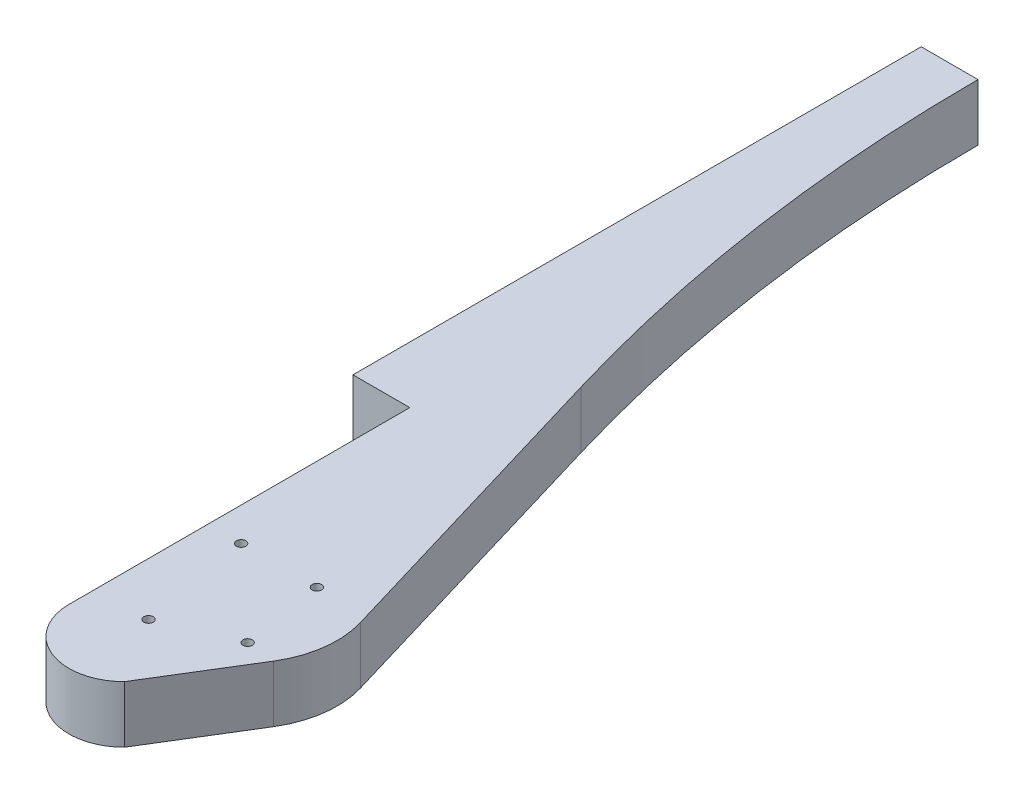
ISO-10303-21;
HEADER;
FILE_DESCRIPTION(('STEP AP214'),'2;1');
FILE_NAME('part.step','',(''),(''),'','','');
FILE_SCHEMA(('AUTOMOTIVE_DESIGN { 1 0 10303 214 1 1 1 1 }'));
ENDSEC;
DATA;
#1=APPLICATION_CONTEXT('core data for automotive mechanical design processes');
#2=APPLICATION_PROTOCOL_DEFINITION('international standard','automotive_design',2000,#1);
#3=PRODUCT_CONTEXT('',#1,'mechanical');
#4=PRODUCT('Part','Part','',(#3));
#5=PRODUCT_RELATED_PRODUCT_CATEGORY('part','',(#4));
#6=PRODUCT_DEFINITION_FORMATION('','',#4);
#7=PRODUCT_DEFINITION_CONTEXT('part definition',#1,'design');
#8=PRODUCT_DEFINITION('design','',#6,#7);
#9=PRODUCT_DEFINITION_SHAPE('','',#8);
#10=(LENGTH_UNIT() NAMED_UNIT(*) SI_UNIT(.MILLI.,.METRE.));
#11=(NAMED_UNIT(*) PLANE_ANGLE_UNIT() SI_UNIT($,.RADIAN.));
#12=(NAMED_UNIT(*) SI_UNIT($,.STERADIAN.) SOLID_ANGLE_UNIT());
#13=UNCERTAINTY_MEASURE_WITH_UNIT(LENGTH_MEASURE(1.E-05),#10,'distance_accuracy_value','');
#14=(GEOMETRIC_REPRESENTATION_CONTEXT(3) GLOBAL_UNCERTAINTY_ASSIGNED_CONTEXT((#13)) GLOBAL_UNIT_ASSIGNED_CONTEXT((#10,
#11,#12)) REPRESENTATION_CONTEXT('',''));
#15=CARTESIAN_POINT('',(0.,0.,0.));
#16=DIRECTION('',(0.,0.,1.));
#17=DIRECTION('',(1.,0.,0.));
#18=AXIS2_PLACEMENT_3D('',#15,#16,#17);
#19=CARTESIAN_POINT('',(545.559709198335,19.05,-304.8));
#20=DIRECTION('',(0.,-1.,0.));
#21=DIRECTION('',(0.,0.,-1.));
#22=AXIS2_PLACEMENT_3D('',#19,#20,#21);
#23=CYLINDRICAL_SURFACE('',#22,545.559709198344);
#24=CARTESIAN_POINT('',(545.559709198335,0.,-304.8));
#25=DIRECTION('',(0.,-1.,0.));
#26=DIRECTION('',(0.,0.,-1.));
#27=AXIS2_PLACEMENT_3D('',#24,#25,#26);
#28=CIRCLE('',#27,545.559709198344);
#29=CARTESIAN_POINT('',(22.7226034286536,0.,-148.989996691602));
#30=VERTEX_POINT('',#29);
#31=CARTESIAN_POINT('',(-1.07275299754406E-11,0.,-304.8));
#32=VERTEX_POINT('',#31);
#33=EDGE_CURVE('E138',#30,#32,#28,.T.);
#34=ORIENTED_EDGE('',*,*,#33,.T.);
#35=DIRECTION('',(0.,-1.,0.));
#36=VECTOR('',#35,1.);
#37=CARTESIAN_POINT('',(-1.07275299754406E-11,19.05,-304.8));
#38=LINE('',#37,#36);
#39=CARTESIAN_POINT('',(-1.07275299754406E-11,19.05,-304.8));
#40=VERTEX_POINT('',#39);
#41=EDGE_CURVE('E11',#40,#32,#38,.T.);
#42=ORIENTED_EDGE('',*,*,#41,.F.);
#43=CARTESIAN_POINT('',(545.559709198335,19.05,-304.8));
#44=DIRECTION('',(0.,-1.,0.));
#45=DIRECTION('',(0.,0.,-1.));
#46=AXIS2_PLACEMENT_3D('',#43,#44,#45);
#47=CIRCLE('',#46,545.559709198344);
#48=CARTESIAN_POINT('',(22.7226034286536,19.05,-148.989996691602));
#49=VERTEX_POINT('',#48);
#50=EDGE_CURVE('E155',#49,#40,#47,.T.);
#51=ORIENTED_EDGE('',*,*,#50,.F.);
#52=DIRECTION('',(0.,-1.,0.));
#53=VECTOR('',#52,1.);
#54=CARTESIAN_POINT('',(22.7226034286536,19.05,-148.989996691602));
#55=LINE('',#54,#53);
#56=EDGE_CURVE('E134',#49,#30,#55,.T.);
#57=ORIENTED_EDGE('',*,*,#56,.T.);
#58=EDGE_LOOP('',(#34,#42,#51,#57));
#59=FACE_BOUND('',#58,.T.);
#60=ADVANCED_FACE('F33',(#59),#23,.F.);
#61=CARTESIAN_POINT('',(-1.07275299754406E-11,19.05,-304.8));
#62=DIRECTION('',(0.,0.,1.));
#63=DIRECTION('',(1.,0.,0.));
#64=AXIS2_PLACEMENT_3D('',#61,#62,#63);
#65=PLANE('',#64);
#66=DIRECTION('',(-1.,0.,0.));
#67=VECTOR('',#66,1.);
#68=CARTESIAN_POINT('',(-1.07275299754406E-11,0.,-304.8));
#69=LINE('',#68,#67);
#70=CARTESIAN_POINT('',(-19.05,0.,-304.8));
#71=VERTEX_POINT('',#70);
#72=EDGE_CURVE('E141',#32,#71,#69,.T.);
#73=ORIENTED_EDGE('',*,*,#72,.T.);
#74=DIRECTION('',(0.,-1.,0.));
#75=VECTOR('',#74,1.);
#76=CARTESIAN_POINT('',(-19.05,19.05,-304.8));
#77=LINE('',#76,#75);
#78=CARTESIAN_POINT('',(-19.05,19.05,-304.8));
#79=VERTEX_POINT('',#78);
#80=EDGE_CURVE('E41',#79,#71,#77,.T.);
#81=ORIENTED_EDGE('',*,*,#80,.F.);
#82=DIRECTION('',(-1.,0.,0.));
#83=VECTOR('',#82,1.);
#84=CARTESIAN_POINT('',(-1.07275299754406E-11,19.05,-304.8));
#85=LINE('',#84,#83);
#86=EDGE_CURVE('E96',#40,#79,#85,.T.);
#87=ORIENTED_EDGE('',*,*,#86,.F.);
#88=ORIENTED_EDGE('',*,*,#41,.T.);
#89=EDGE_LOOP('',(#73,#81,#87,#88));
#90=FACE_BOUND('',#89,.T.);
#91=ADVANCED_FACE('F268',(#90),#65,.F.);
#92=CARTESIAN_POINT('',(-19.05,19.05,-304.8));
#93=DIRECTION('',(1.,0.,0.));
#94=DIRECTION('',(0.,0.,-1.));
#95=AXIS2_PLACEMENT_3D('',#92,#93,#94);
#96=PLANE('',#95);
#97=DIRECTION('',(0.,0.,1.));
#98=VECTOR('',#97,1.);
#99=CARTESIAN_POINT('',(-19.05,0.,-304.8));
#100=LINE('',#99,#98);
#101=CARTESIAN_POINT('',(-19.05,0.,-114.3));
#102=VERTEX_POINT('',#101);
#103=EDGE_CURVE('E144',#71,#102,#100,.T.);
#104=ORIENTED_EDGE('',*,*,#103,.T.);
#105=DIRECTION('',(0.,-1.,0.));
#106=VECTOR('',#105,1.);
#107=CARTESIAN_POINT('',(-19.05,19.05,-114.3));
#108=LINE('',#107,#106);
#109=CARTESIAN_POINT('',(-19.05,19.05,-114.3));
#110=VERTEX_POINT('',#109);
#111=EDGE_CURVE('E165',#110,#102,#108,.T.);
#112=ORIENTED_EDGE('',*,*,#111,.F.);
#113=DIRECTION('',(0.,0.,1.));
#114=VECTOR('',#113,1.);
#115=CARTESIAN_POINT('',(-19.05,19.05,-304.8));
#116=LINE('',#115,#114);
#117=EDGE_CURVE('E173',#79,#110,#116,.T.);
#118=ORIENTED_EDGE('',*,*,#117,.F.);
#119=ORIENTED_EDGE('',*,*,#80,.T.);
#120=EDGE_LOOP('',(#104,#112,#118,#119));
#121=FACE_BOUND('',#120,.T.);
#122=ADVANCED_FACE('F171',(#121),#96,.F.);
#123=CARTESIAN_POINT('',(-19.05,19.05,-114.3));
#124=DIRECTION('',(0.,0.,-1.));
#125=DIRECTION('',(-1.,0.,0.));
#126=AXIS2_PLACEMENT_3D('',#123,#124,#125);
#127=PLANE('',#126);
#128=DIRECTION('',(1.,0.,0.));
#129=VECTOR('',#128,1.);
#130=CARTESIAN_POINT('',(-19.05,0.,-114.3));
#131=LINE('',#130,#129);
#132=CARTESIAN_POINT('',(0.,0.,-114.3));
#133=VERTEX_POINT('',#132);
#134=EDGE_CURVE('E146',#102,#133,#131,.T.);
#135=ORIENTED_EDGE('',*,*,#134,.T.);
#136=DIRECTION('',(0.,-1.,0.));
#137=VECTOR('',#136,1.);
#138=CARTESIAN_POINT('',(0.,19.05,-114.3));
#139=LINE('',#138,#137);
#140=CARTESIAN_POINT('',(0.,19.05,-114.3));
#141=VERTEX_POINT('',#140);
#142=EDGE_CURVE('E162',#141,#133,#139,.T.);
#143=ORIENTED_EDGE('',*,*,#142,.F.);
#144=DIRECTION('',(1.,0.,0.));
#145=VECTOR('',#144,1.);
#146=CARTESIAN_POINT('',(-19.05,19.05,-114.3));
#147=LINE('',#146,#145);
#148=EDGE_CURVE('E189',#110,#141,#147,.T.);
#149=ORIENTED_EDGE('',*,*,#148,.F.);
#150=ORIENTED_EDGE('',*,*,#111,.T.);
#151=EDGE_LOOP('',(#135,#143,#149,#150));
#152=FACE_BOUND('',#151,.T.);
#153=ADVANCED_FACE('F182',(#152),#127,.F.);
#154=CARTESIAN_POINT('',(0.,19.05,-114.3));
#155=DIRECTION('',(1.,0.,0.));
#156=DIRECTION('',(0.,0.,-1.));
#157=AXIS2_PLACEMENT_3D('',#154,#155,#156);
#158=PLANE('',#157);
#159=DIRECTION('',(0.,0.,1.));
#160=VECTOR('',#159,1.);
#161=CARTESIAN_POINT('',(0.,0.,-114.3));
#162=LINE('',#161,#160);
#163=CARTESIAN_POINT('',(0.,0.,0.));
#164=VERTEX_POINT('',#163);
#165=EDGE_CURVE('E148',#133,#164,#162,.T.);
#166=ORIENTED_EDGE('',*,*,#165,.T.);
#167=DIRECTION('',(0.,-1.,0.));
#168=VECTOR('',#167,1.);
#169=CARTESIAN_POINT('',(0.,19.05,0.));
#170=LINE('',#169,#168);
#171=CARTESIAN_POINT('',(0.,19.05,0.));
#172=VERTEX_POINT('',#171);
#173=EDGE_CURVE('E159',#172,#164,#170,.T.);
#174=ORIENTED_EDGE('',*,*,#173,.F.);
#175=DIRECTION('',(0.,0.,1.));
#176=VECTOR('',#175,1.);
#177=CARTESIAN_POINT('',(0.,19.05,-114.3));
#178=LINE('',#177,#176);
#179=EDGE_CURVE('E188',#141,#172,#178,.T.);
#180=ORIENTED_EDGE('',*,*,#179,.F.);
#181=ORIENTED_EDGE('',*,*,#142,.T.);
#182=EDGE_LOOP('',(#166,#174,#180,#181));
#183=FACE_BOUND('',#182,.T.);
#184=ADVANCED_FACE('F186',(#183),#158,.F.);
#185=CARTESIAN_POINT('',(18.5666089965398,19.05,0.));
#186=DIRECTION('',(0.,-1.,0.));
#187=DIRECTION('',(0.,0.,-1.));
#188=AXIS2_PLACEMENT_3D('',#185,#186,#187);
#189=CYLINDRICAL_SURFACE('',#188,18.5666089965398);
#190=CARTESIAN_POINT('',(18.5666089965398,0.,0.));
#191=DIRECTION('',(0.,1.,0.));
#192=DIRECTION('',(0.,0.,1.));
#193=AXIS2_PLACEMENT_3D('',#190,#191,#192);
#194=CIRCLE('',#193,18.5666089965398);
#195=CARTESIAN_POINT('',(31.75,0.,13.0735294117647));
#196=VERTEX_POINT('',#195);
#197=EDGE_CURVE('E150',#164,#196,#194,.T.);
#198=ORIENTED_EDGE('',*,*,#197,.T.);
#199=DIRECTION('',(0.,-1.,0.));
#200=VECTOR('',#199,1.);
#201=CARTESIAN_POINT('',(31.75,19.05,13.0735294117647));
#202=LINE('',#201,#200);
#203=CARTESIAN_POINT('',(31.75,19.05,13.0735294117647));
#204=VERTEX_POINT('',#203);
#205=EDGE_CURVE('E129',#204,#196,#202,.T.);
#206=ORIENTED_EDGE('',*,*,#205,.F.);
#207=CARTESIAN_POINT('',(18.5666089965398,19.05,0.));
#208=DIRECTION('',(0.,1.,0.));
#209=DIRECTION('',(0.,0.,1.));
#210=AXIS2_PLACEMENT_3D('',#207,#208,#209);
#211=CIRCLE('',#210,18.5666089965398);
#212=EDGE_CURVE('E120',#172,#204,#211,.T.);
#213=ORIENTED_EDGE('',*,*,#212,.F.);
#214=ORIENTED_EDGE('',*,*,#173,.T.);
#215=EDGE_LOOP('',(#198,#206,#213,#214));
#216=FACE_BOUND('',#215,.T.);
#217=ADVANCED_FACE('F276',(#216),#189,.T.);
#218=CARTESIAN_POINT('',(31.75,19.05,13.0735294117647));
#219=DIRECTION('',(-0.852079388461186,0.,-0.523412567445234));
#220=DIRECTION('',(-0.523412567445234,0.,0.852079388461186));
#221=AXIS2_PLACEMENT_3D('',#218,#219,#220);
#222=PLANE('',#221);
#223=DIRECTION('',(0.523412567445234,0.,-0.852079388461186));
#224=VECTOR('',#223,1.);
#225=CARTESIAN_POINT('',(31.75,0.,13.0735294117647));
#226=LINE('',#225,#224);
#227=CARTESIAN_POINT('',(50.7652023278703,0.,-17.8819022663116));
#228=VERTEX_POINT('',#227);
#229=EDGE_CURVE('E128',#196,#228,#226,.T.);
#230=ORIENTED_EDGE('',*,*,#229,.T.);
#231=DIRECTION('',(0.,-1.,0.));
#232=VECTOR('',#231,1.);
#233=CARTESIAN_POINT('',(50.7652023278703,19.05,-17.8819022663116));
#234=LINE('',#233,#232);
#235=CARTESIAN_POINT('',(50.7652023278703,19.05,-17.8819022663116));
#236=VERTEX_POINT('',#235);
#237=EDGE_CURVE('E125',#236,#228,#234,.T.);
#238=ORIENTED_EDGE('',*,*,#237,.F.);
#239=DIRECTION('',(0.523412567445234,0.,-0.852079388461186));
#240=VECTOR('',#239,1.);
#241=CARTESIAN_POINT('',(31.75,19.05,13.0735294117647));
#242=LINE('',#241,#240);
#243=EDGE_CURVE('E114',#204,#236,#242,.T.);
#244=ORIENTED_EDGE('',*,*,#243,.F.);
#245=ORIENTED_EDGE('',*,*,#205,.T.);
#246=EDGE_LOOP('',(#230,#238,#244,#245));
#247=FACE_BOUND('',#246,.T.);
#248=ADVANCED_FACE('F126',(#247),#222,.F.);
#249=CARTESIAN_POINT('',(23.7116817442277,19.05,-34.5002512826978));
#250=DIRECTION('',(0.,-1.,0.));
#251=DIRECTION('',(0.,0.,-1.));
#252=AXIS2_PLACEMENT_3D('',#249,#250,#251);
#253=CYLINDRICAL_SURFACE('',#252,31.75);
#254=CARTESIAN_POINT('',(23.7116817442277,0.,-34.5002512826978));
#255=DIRECTION('',(0.,1.,0.));
#256=DIRECTION('',(0.,0.,1.));
#257=AXIS2_PLACEMENT_3D('',#254,#255,#256);
#258=CIRCLE('',#257,31.75);
#259=CARTESIAN_POINT('',(54.1392918266872,0.,-43.5679436390698));
#260=VERTEX_POINT('',#259);
#261=EDGE_CURVE('E82',#228,#260,#258,.T.);
#262=ORIENTED_EDGE('',*,*,#261,.T.);
#263=DIRECTION('',(0.,-1.,0.));
#264=VECTOR('',#263,1.);
#265=CARTESIAN_POINT('',(54.1392918266872,19.05,-43.5679436390698));
#266=LINE('',#265,#264);
#267=CARTESIAN_POINT('',(54.1392918266872,19.05,-43.5679436390698));
#268=VERTEX_POINT('',#267);
#269=EDGE_CURVE('E130',#268,#260,#266,.T.);
#270=ORIENTED_EDGE('',*,*,#269,.F.);
#271=CARTESIAN_POINT('',(23.7116817442277,19.05,-34.5002512826978));
#272=DIRECTION('',(0.,1.,0.));
#273=DIRECTION('',(0.,0.,1.));
#274=AXIS2_PLACEMENT_3D('',#271,#272,#273);
#275=CIRCLE('',#274,31.75);
#276=EDGE_CURVE('E118',#236,#268,#275,.T.);
#277=ORIENTED_EDGE('',*,*,#276,.F.);
#278=ORIENTED_EDGE('',*,*,#237,.T.);
#279=EDGE_LOOP('',(#262,#270,#277,#278));
#280=FACE_BOUND('',#279,.T.);
#281=ADVANCED_FACE('F132',(#280),#253,.T.);
#282=CARTESIAN_POINT('',(54.1392918266872,19.05,-43.5679436390698));
#283=DIRECTION('',(-0.958349923856993,0.,0.285596609649513));
#284=DIRECTION('',(0.285596609649513,0.,0.958349923856993));
#285=AXIS2_PLACEMENT_3D('',#282,#283,#284);
#286=PLANE('',#285);
#287=DIRECTION('',(-0.285596609649513,0.,-0.958349923856993));
#288=VECTOR('',#287,1.);
#289=CARTESIAN_POINT('',(54.1392918266872,0.,-43.5679436390698));
#290=LINE('',#289,#288);
#291=EDGE_CURVE('E88',#260,#30,#290,.T.);
#292=ORIENTED_EDGE('',*,*,#291,.T.);
#293=ORIENTED_EDGE('',*,*,#56,.F.);
#294=DIRECTION('',(-0.285596609649513,0.,-0.958349923856993));
#295=VECTOR('',#294,1.);
#296=CARTESIAN_POINT('',(54.1392918266872,19.05,-43.5679436390698));
#297=LINE('',#296,#295);
#298=EDGE_CURVE('E49',#268,#49,#297,.T.);
#299=ORIENTED_EDGE('',*,*,#298,.F.);
#300=ORIENTED_EDGE('',*,*,#269,.T.);
#301=EDGE_LOOP('',(#292,#293,#299,#300));
#302=FACE_BOUND('',#301,.T.);
#303=ADVANCED_FACE('F242',(#302),#286,.F.);
#304=CARTESIAN_POINT('',(545.559709198335,19.05,-304.8));
#305=DIRECTION('',(0.,-1.,0.));
#306=DIRECTION('',(0.,0.,-1.));
#307=AXIS2_PLACEMENT_3D('',#304,#305,#306);
#308=PLANE('',#307);
#309=CARTESIAN_POINT('',(36.5781808712527,19.05,-46.5708997576497));
#310=DIRECTION('',(0.,1.,0.));
#311=DIRECTION('',(0.,0.,1.));
#312=AXIS2_PLACEMENT_3D('',#309,#310,#311);
#313=CIRCLE('',#312,1.58749999999999);
#314=CARTESIAN_POINT('',(36.5781808712527,19.05,-44.9833997576497));
#315=VERTEX_POINT('',#314);
#316=EDGE_CURVE('E234',#315,#315,#313,.T.);
#317=ORIENTED_EDGE('',*,*,#316,.F.);
#318=EDGE_LOOP('',(#317));
#319=FACE_BOUND('',#318,.T.);
#320=CARTESIAN_POINT('',(11.1781808712527,19.05,-46.576310917709));
#321=DIRECTION('',(0.,1.,0.));
#322=DIRECTION('',(0.,0.,1.));
#323=AXIS2_PLACEMENT_3D('',#320,#321,#322);
#324=CIRCLE('',#323,1.58749999999999);
#325=CARTESIAN_POINT('',(11.1781808712527,19.05,-44.988810917709));
#326=VERTEX_POINT('',#325);
#327=EDGE_CURVE('E228',#326,#326,#324,.T.);
#328=ORIENTED_EDGE('',*,*,#327,.F.);
#329=EDGE_LOOP('',(#328));
#330=FACE_BOUND('',#329,.T.);
#331=CARTESIAN_POINT('',(17.7079179818777,19.05,-9.00599211309875));
#332=DIRECTION('',(0.,1.,0.));
#333=DIRECTION('',(0.,0.,1.));
#334=AXIS2_PLACEMENT_3D('',#331,#332,#333);
#335=CIRCLE('',#334,1.58749999999999);
#336=CARTESIAN_POINT('',(17.7079179818777,19.05,-7.41849211309877));
#337=VERTEX_POINT('',#336);
#338=EDGE_CURVE('E222',#337,#337,#335,.T.);
#339=ORIENTED_EDGE('',*,*,#338,.F.);
#340=EDGE_LOOP('',(#339));
#341=FACE_BOUND('',#340,.T.);
#342=CARTESIAN_POINT('',(41.0379900090218,19.05,-18.900486467268));
#343=DIRECTION('',(0.,1.,0.));
#344=DIRECTION('',(0.,0.,1.));
#345=AXIS2_PLACEMENT_3D('',#342,#343,#344);
#346=CIRCLE('',#345,1.58749999999999);
#347=CARTESIAN_POINT('',(41.0379900090218,19.05,-17.312986467268));
#348=VERTEX_POINT('',#347);
#349=EDGE_CURVE('E216',#348,#348,#346,.T.);
#350=ORIENTED_EDGE('',*,*,#349,.F.);
#351=EDGE_LOOP('',(#350));
#352=FACE_BOUND('',#351,.T.);
#353=ORIENTED_EDGE('',*,*,#50,.T.);
#354=ORIENTED_EDGE('',*,*,#86,.T.);
#355=ORIENTED_EDGE('',*,*,#117,.T.);
#356=ORIENTED_EDGE('',*,*,#148,.T.);
#357=ORIENTED_EDGE('',*,*,#179,.T.);
#358=ORIENTED_EDGE('',*,*,#212,.T.);
#359=ORIENTED_EDGE('',*,*,#243,.T.);
#360=ORIENTED_EDGE('',*,*,#276,.T.);
#361=ORIENTED_EDGE('',*,*,#298,.T.);
#362=EDGE_LOOP('',(#353,#354,#355,#356,#357,#358,#359,#360,#361));
#363=FACE_BOUND('',#362,.T.);
#364=ADVANCED_FACE('F116',(#319,#330,#341,#352,#363),#308,.F.);
#365=CARTESIAN_POINT('',(545.559709198335,0.,-304.8));
#366=DIRECTION('',(0.,-1.,0.));
#367=DIRECTION('',(0.,0.,-1.));
#368=AXIS2_PLACEMENT_3D('',#365,#366,#367);
#369=PLANE('',#368);
#370=CARTESIAN_POINT('',(36.5781808712527,0.,-46.5708997576497));
#371=DIRECTION('',(0.,1.,0.));
#372=DIRECTION('',(0.,0.,1.));
#373=AXIS2_PLACEMENT_3D('',#370,#371,#372);
#374=CIRCLE('',#373,1.5875);
#375=CARTESIAN_POINT('',(36.5781808712527,0.,-44.9833997576497));
#376=VERTEX_POINT('',#375);
#377=EDGE_CURVE('E231',#376,#376,#374,.T.);
#378=ORIENTED_EDGE('',*,*,#377,.T.);
#379=EDGE_LOOP('',(#378));
#380=FACE_BOUND('',#379,.T.);
#381=CARTESIAN_POINT('',(11.1781808712527,0.,-46.576310917709));
#382=DIRECTION('',(0.,1.,0.));
#383=DIRECTION('',(0.,0.,1.));
#384=AXIS2_PLACEMENT_3D('',#381,#382,#383);
#385=CIRCLE('',#384,1.5875);
#386=CARTESIAN_POINT('',(11.1781808712527,0.,-44.988810917709));
#387=VERTEX_POINT('',#386);
#388=EDGE_CURVE('E225',#387,#387,#385,.T.);
#389=ORIENTED_EDGE('',*,*,#388,.T.);
#390=EDGE_LOOP('',(#389));
#391=FACE_BOUND('',#390,.T.);
#392=CARTESIAN_POINT('',(17.7079179818777,0.,-9.00599211309875));
#393=DIRECTION('',(0.,1.,0.));
#394=DIRECTION('',(0.,0.,1.));
#395=AXIS2_PLACEMENT_3D('',#392,#393,#394);
#396=CIRCLE('',#395,1.5875);
#397=CARTESIAN_POINT('',(17.7079179818777,0.,-7.41849211309876));
#398=VERTEX_POINT('',#397);
#399=EDGE_CURVE('E219',#398,#398,#396,.T.);
#400=ORIENTED_EDGE('',*,*,#399,.T.);
#401=EDGE_LOOP('',(#400));
#402=FACE_BOUND('',#401,.T.);
#403=CARTESIAN_POINT('',(41.0379900090218,0.,-18.900486467268));
#404=DIRECTION('',(0.,1.,0.));
#405=DIRECTION('',(0.,0.,1.));
#406=AXIS2_PLACEMENT_3D('',#403,#404,#405);
#407=CIRCLE('',#406,1.5875);
#408=CARTESIAN_POINT('',(41.0379900090218,0.,-17.312986467268));
#409=VERTEX_POINT('',#408);
#410=EDGE_CURVE('E213',#409,#409,#407,.T.);
#411=ORIENTED_EDGE('',*,*,#410,.T.);
#412=EDGE_LOOP('',(#411));
#413=FACE_BOUND('',#412,.T.);
#414=CARTESIAN_POINT('',(3.22055160715236,0.,-139.7));
#415=DIRECTION('',(0.,-1.,0.));
#416=DIRECTION('',(0.,0.,-1.));
#417=AXIS2_PLACEMENT_3D('',#414,#415,#416);
#418=CIRCLE('',#417,1.58749999999999);
#419=CARTESIAN_POINT('',(3.22055160715236,0.,-141.2875));
#420=VERTEX_POINT('',#419);
#421=EDGE_CURVE('E210',#420,#420,#418,.T.);
#422=ORIENTED_EDGE('',*,*,#421,.F.);
#423=EDGE_LOOP('',(#422));
#424=FACE_BOUND('',#423,.T.);
#425=CARTESIAN_POINT('',(18.5666089965398,0.,0.));
#426=DIRECTION('',(0.,-1.,0.));
#427=DIRECTION('',(0.,0.,-1.));
#428=AXIS2_PLACEMENT_3D('',#425,#426,#427);
#429=CIRCLE('',#428,1.58749999999999);
#430=CARTESIAN_POINT('',(18.5666089965398,0.,-1.58749999999999));
#431=VERTEX_POINT('',#430);
#432=EDGE_CURVE('E204',#431,#431,#429,.T.);
#433=ORIENTED_EDGE('',*,*,#432,.F.);
#434=EDGE_LOOP('',(#433));
#435=FACE_BOUND('',#434,.T.);
#436=CARTESIAN_POINT('',(-9.52500000000001,0.,-279.4));
#437=DIRECTION('',(0.,-1.,0.));
#438=DIRECTION('',(0.,0.,-1.));
#439=AXIS2_PLACEMENT_3D('',#436,#437,#438);
#440=CIRCLE('',#439,1.58749999999999);
#441=CARTESIAN_POINT('',(-9.52500000000001,0.,-280.9875));
#442=VERTEX_POINT('',#441);
#443=EDGE_CURVE('E198',#442,#442,#440,.T.);
#444=ORIENTED_EDGE('',*,*,#443,.F.);
#445=EDGE_LOOP('',(#444));
#446=FACE_BOUND('',#445,.T.);
#447=ORIENTED_EDGE('',*,*,#33,.F.);
#448=ORIENTED_EDGE('',*,*,#291,.F.);
#449=ORIENTED_EDGE('',*,*,#261,.F.);
#450=ORIENTED_EDGE('',*,*,#229,.F.);
#451=ORIENTED_EDGE('',*,*,#197,.F.);
#452=ORIENTED_EDGE('',*,*,#165,.F.);
#453=ORIENTED_EDGE('',*,*,#134,.F.);
#454=ORIENTED_EDGE('',*,*,#103,.F.);
#455=ORIENTED_EDGE('',*,*,#72,.F.);
#456=EDGE_LOOP('',(#447,#448,#449,#450,#451,#452,#453,#454,#455));
#457=FACE_BOUND('',#456,.T.);
#458=ADVANCED_FACE('F177',(#380,#391,#402,#413,#424,#435,#446,#457),#369,.T.);
#459=CARTESIAN_POINT('',(-9.52500000000001,11.1252,-279.4));
#460=DIRECTION('',(0.,-1.,0.));
#461=DIRECTION('',(0.,0.,-1.));
#462=AXIS2_PLACEMENT_3D('',#459,#460,#461);
#463=CONICAL_SURFACE('',#462,1.5875,1.02974425867665);
#464=CARTESIAN_POINT('',(-9.52500000000001,12.0790662327063,-279.4));
#465=VERTEX_POINT('',#464);
#466=VERTEX_LOOP('',#465);
#467=FACE_BOUND('',#466,.T.);
#468=CARTESIAN_POINT('',(-9.52500000000001,11.1252,-279.4));
#469=DIRECTION('',(0.,-1.,0.));
#470=DIRECTION('',(0.,0.,-1.));
#471=AXIS2_PLACEMENT_3D('',#468,#469,#470);
#472=CIRCLE('',#471,1.5875);
#473=CARTESIAN_POINT('',(-9.52500000000001,11.1252,-280.9875));
#474=VERTEX_POINT('',#473);
#475=EDGE_CURVE('E142',#474,#474,#472,.T.);
#476=ORIENTED_EDGE('',*,*,#475,.T.);
#477=EDGE_LOOP('',(#476));
#478=FACE_BOUND('',#477,.T.);
#479=ADVANCED_FACE('F334',(#467,#478),#463,.F.);
#480=CARTESIAN_POINT('',(-9.52500000000001,0.,-279.4));
#481=DIRECTION('',(0.,-1.,0.));
#482=DIRECTION('',(0.,0.,-1.));
#483=AXIS2_PLACEMENT_3D('',#480,#481,#482);
#484=CYLINDRICAL_SURFACE('',#483,1.58749999999999);
#485=ORIENTED_EDGE('',*,*,#475,.F.);
#486=EDGE_LOOP('',(#485));
#487=FACE_BOUND('',#486,.T.);
#488=ORIENTED_EDGE('',*,*,#443,.T.);
#489=EDGE_LOOP('',(#488));
#490=FACE_BOUND('',#489,.T.);
#491=ADVANCED_FACE('F339',(#487,#490),#484,.F.);
#492=CARTESIAN_POINT('',(18.5666089965398,11.1252,0.));
#493=DIRECTION('',(0.,-1.,0.));
#494=DIRECTION('',(0.,0.,-1.));
#495=AXIS2_PLACEMENT_3D('',#492,#493,#494);
#496=CONICAL_SURFACE('',#495,1.5875,1.02974425867665);
#497=CARTESIAN_POINT('',(18.5666089965398,12.0790662327063,0.));
#498=VERTEX_POINT('',#497);
#499=VERTEX_LOOP('',#498);
#500=FACE_BOUND('',#499,.T.);
#501=CARTESIAN_POINT('',(18.5666089965398,11.1252,0.));
#502=DIRECTION('',(0.,-1.,0.));
#503=DIRECTION('',(0.,0.,-1.));
#504=AXIS2_PLACEMENT_3D('',#501,#502,#503);
#505=CIRCLE('',#504,1.5875);
#506=CARTESIAN_POINT('',(18.5666089965398,11.1252,-1.5875));
#507=VERTEX_POINT('',#506);
#508=EDGE_CURVE('E201',#507,#507,#505,.T.);
#509=ORIENTED_EDGE('',*,*,#508,.T.);
#510=EDGE_LOOP('',(#509));
#511=FACE_BOUND('',#510,.T.);
#512=ADVANCED_FACE('F351',(#500,#511),#496,.F.);
#513=CARTESIAN_POINT('',(18.5666089965398,0.,0.));
#514=DIRECTION('',(0.,-1.,0.));
#515=DIRECTION('',(0.,0.,-1.));
#516=AXIS2_PLACEMENT_3D('',#513,#514,#515);
#517=CYLINDRICAL_SURFACE('',#516,1.58749999999999);
#518=ORIENTED_EDGE('',*,*,#508,.F.);
#519=EDGE_LOOP('',(#518));
#520=FACE_BOUND('',#519,.T.);
#521=ORIENTED_EDGE('',*,*,#432,.T.);
#522=EDGE_LOOP('',(#521));
#523=FACE_BOUND('',#522,.T.);
#524=ADVANCED_FACE('F361',(#520,#523),#517,.F.);
#525=CARTESIAN_POINT('',(3.22055160715236,11.1252,-139.7));
#526=DIRECTION('',(0.,-1.,0.));
#527=DIRECTION('',(0.,0.,-1.));
#528=AXIS2_PLACEMENT_3D('',#525,#526,#527);
#529=CONICAL_SURFACE('',#528,1.5875,1.02974425867665);
#530=CARTESIAN_POINT('',(3.22055160715236,12.0790662327063,-139.7));
#531=VERTEX_POINT('',#530);
#532=VERTEX_LOOP('',#531);
#533=FACE_BOUND('',#532,.T.);
#534=CARTESIAN_POINT('',(3.22055160715236,11.1252,-139.7));
#535=DIRECTION('',(0.,-1.,0.));
#536=DIRECTION('',(0.,0.,-1.));
#537=AXIS2_PLACEMENT_3D('',#534,#535,#536);
#538=CIRCLE('',#537,1.5875);
#539=CARTESIAN_POINT('',(3.22055160715236,11.1252,-141.2875));
#540=VERTEX_POINT('',#539);
#541=EDGE_CURVE('E207',#540,#540,#538,.T.);
#542=ORIENTED_EDGE('',*,*,#541,.T.);
#543=EDGE_LOOP('',(#542));
#544=FACE_BOUND('',#543,.T.);
#545=ADVANCED_FACE('F263',(#533,#544),#529,.F.);
#546=CARTESIAN_POINT('',(3.22055160715236,0.,-139.7));
#547=DIRECTION('',(0.,-1.,0.));
#548=DIRECTION('',(0.,0.,-1.));
#549=AXIS2_PLACEMENT_3D('',#546,#547,#548);
#550=CYLINDRICAL_SURFACE('',#549,1.58749999999999);
#551=ORIENTED_EDGE('',*,*,#541,.F.);
#552=EDGE_LOOP('',(#551));
#553=FACE_BOUND('',#552,.T.);
#554=ORIENTED_EDGE('',*,*,#421,.T.);
#555=EDGE_LOOP('',(#554));
#556=FACE_BOUND('',#555,.T.);
#557=ADVANCED_FACE('F253',(#553,#556),#550,.F.);
#558=CARTESIAN_POINT('',(41.0379900090218,19.05,-18.900486467268));
#559=DIRECTION('',(0.,1.,0.));
#560=DIRECTION('',(0.,0.,1.));
#561=AXIS2_PLACEMENT_3D('',#558,#559,#560);
#562=CYLINDRICAL_SURFACE('',#561,1.5875);
#563=ORIENTED_EDGE('',*,*,#410,.F.);
#564=EDGE_LOOP('',(#563));
#565=FACE_BOUND('',#564,.T.);
#566=ORIENTED_EDGE('',*,*,#349,.T.);
#567=EDGE_LOOP('',(#566));
#568=FACE_BOUND('',#567,.T.);
#569=ADVANCED_FACE('F250',(#565,#568),#562,.F.);
#570=CARTESIAN_POINT('',(17.7079179818777,19.05,-9.00599211309875));
#571=DIRECTION('',(0.,1.,0.));
#572=DIRECTION('',(0.,0.,1.));
#573=AXIS2_PLACEMENT_3D('',#570,#571,#572);
#574=CYLINDRICAL_SURFACE('',#573,1.58749999999999);
#575=ORIENTED_EDGE('',*,*,#399,.F.);
#576=EDGE_LOOP('',(#575));
#577=FACE_BOUND('',#576,.T.);
#578=ORIENTED_EDGE('',*,*,#338,.T.);
#579=EDGE_LOOP('',(#578));
#580=FACE_BOUND('',#579,.T.);
#581=ADVANCED_FACE('F252',(#577,#580),#574,.F.);
#582=CARTESIAN_POINT('',(11.1781808712527,19.05,-46.576310917709));
#583=DIRECTION('',(0.,1.,0.));
#584=DIRECTION('',(0.,0.,1.));
#585=AXIS2_PLACEMENT_3D('',#582,#583,#584);
#586=CYLINDRICAL_SURFACE('',#585,1.58749999999999);
#587=ORIENTED_EDGE('',*,*,#388,.F.);
#588=EDGE_LOOP('',(#587));
#589=FACE_BOUND('',#588,.T.);
#590=ORIENTED_EDGE('',*,*,#327,.T.);
#591=EDGE_LOOP('',(#590));
#592=FACE_BOUND('',#591,.T.);
#593=ADVANCED_FACE('F260',(#589,#592),#586,.F.);
#594=CARTESIAN_POINT('',(36.5781808712527,19.05,-46.5708997576497));
#595=DIRECTION('',(0.,1.,0.));
#596=DIRECTION('',(0.,0.,1.));
#597=AXIS2_PLACEMENT_3D('',#594,#595,#596);
#598=CYLINDRICAL_SURFACE('',#597,1.5875);
#599=ORIENTED_EDGE('',*,*,#377,.F.);
#600=EDGE_LOOP('',(#599));
#601=FACE_BOUND('',#600,.T.);
#602=ORIENTED_EDGE('',*,*,#316,.T.);
#603=EDGE_LOOP('',(#602));
#604=FACE_BOUND('',#603,.T.);
#605=ADVANCED_FACE('F238',(#601,#604),#598,.F.);
#606=CLOSED_SHELL('',(#60,#91,#122,#153,#184,#217,#248,#281,#303,#364,#458,#479,#491,#512,#524,
#545,#557,#569,#581,#593,#605));
#607=MANIFOLD_SOLID_BREP('B2',#606);
#608=ADVANCED_BREP_SHAPE_REPRESENTATION('',(#18,#607),#14);
#609=SHAPE_DEFINITION_REPRESENTATION(#9,#608);
ENDSEC;
END-ISO-10303-21;
